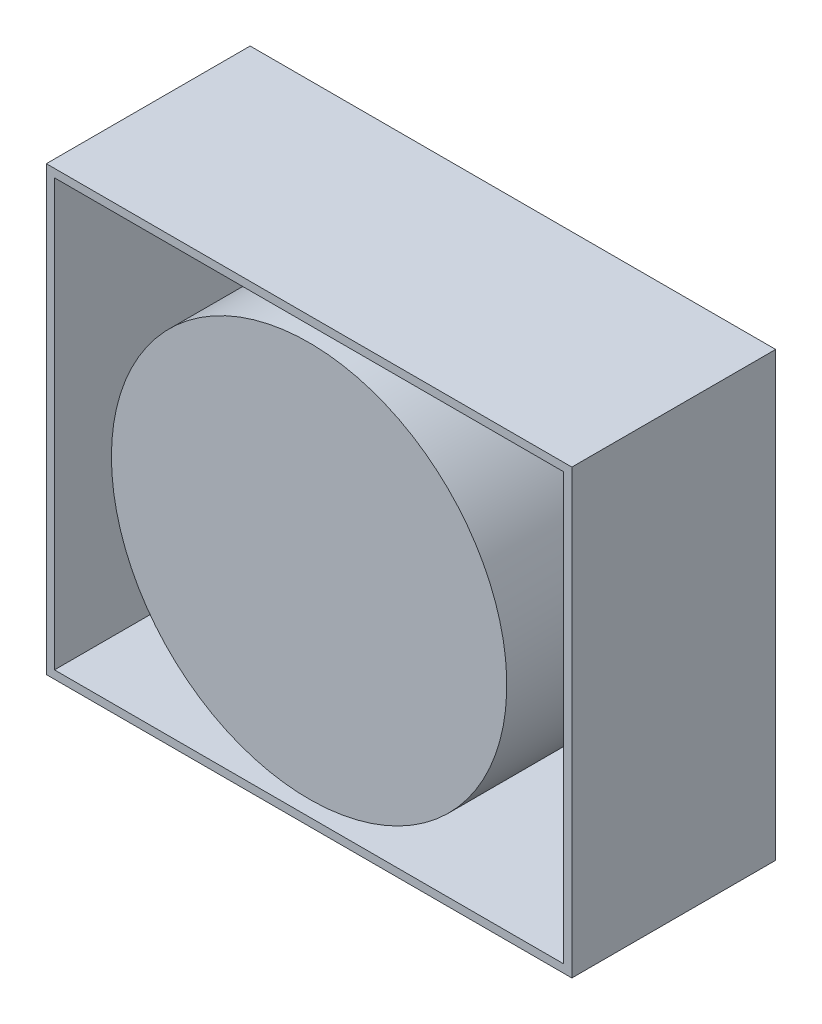
ISO-10303-21;
HEADER;
FILE_DESCRIPTION(('STEP AP214'),'2;1');
FILE_NAME('part.step','',(''),(''),'','','');
FILE_SCHEMA(('AUTOMOTIVE_DESIGN { 1 0 10303 214 1 1 1 1 }'));
ENDSEC;
DATA;
#1=APPLICATION_CONTEXT('core data for automotive mechanical design processes');
#2=APPLICATION_PROTOCOL_DEFINITION('international standard','automotive_design',2000,#1);
#3=PRODUCT_CONTEXT('',#1,'mechanical');
#4=PRODUCT('Part','Part','',(#3));
#5=PRODUCT_RELATED_PRODUCT_CATEGORY('part','',(#4));
#6=PRODUCT_DEFINITION_FORMATION('','',#4);
#7=PRODUCT_DEFINITION_CONTEXT('part definition',#1,'design');
#8=PRODUCT_DEFINITION('design','',#6,#7);
#9=PRODUCT_DEFINITION_SHAPE('','',#8);
#10=(LENGTH_UNIT() NAMED_UNIT(*) SI_UNIT(.MILLI.,.METRE.));
#11=(NAMED_UNIT(*) PLANE_ANGLE_UNIT() SI_UNIT($,.RADIAN.));
#12=(NAMED_UNIT(*) SI_UNIT($,.STERADIAN.) SOLID_ANGLE_UNIT());
#13=UNCERTAINTY_MEASURE_WITH_UNIT(LENGTH_MEASURE(1.E-05),#10,'distance_accuracy_value','');
#14=(GEOMETRIC_REPRESENTATION_CONTEXT(3) GLOBAL_UNCERTAINTY_ASSIGNED_CONTEXT((#13)) GLOBAL_UNIT_ASSIGNED_CONTEXT((#10,
#11,#12)) REPRESENTATION_CONTEXT('',''));
#15=CARTESIAN_POINT('',(0.,0.,0.));
#16=DIRECTION('',(0.,0.,1.));
#17=DIRECTION('',(1.,0.,0.));
#18=AXIS2_PLACEMENT_3D('',#15,#16,#17);
#19=CARTESIAN_POINT('',(46.4615487348284,43.7559565394266,20.));
#20=DIRECTION('',(0.,0.,-1.));
#21=DIRECTION('',(-1.,0.,0.));
#22=AXIS2_PLACEMENT_3D('',#19,#20,#21);
#23=CYLINDRICAL_SURFACE('',#22,6.12069122546169);
#24=CARTESIAN_POINT('',(46.4615487348284,43.7559565394266,20.));
#25=DIRECTION('',(0.,0.,1.));
#26=DIRECTION('',(1.,0.,0.));
#27=AXIS2_PLACEMENT_3D('',#24,#25,#26);
#28=CIRCLE('',#27,6.12069122546169);
#29=CARTESIAN_POINT('',(52.5822399602901,43.7559565394266,20.));
#30=VERTEX_POINT('',#29);
#31=EDGE_CURVE('E11',#30,#30,#28,.T.);
#32=ORIENTED_EDGE('',*,*,#31,.F.);
#33=EDGE_LOOP('',(#32));
#34=FACE_BOUND('',#33,.T.);
#35=CARTESIAN_POINT('',(46.4615487348284,43.7559565394266,0.));
#36=DIRECTION('',(0.,0.,1.));
#37=DIRECTION('',(1.,0.,0.));
#38=AXIS2_PLACEMENT_3D('',#35,#36,#37);
#39=CIRCLE('',#38,6.12069122546169);
#40=CARTESIAN_POINT('',(52.5822399602901,43.7559565394266,0.));
#41=VERTEX_POINT('',#40);
#42=EDGE_CURVE('E43',#41,#41,#39,.T.);
#43=ORIENTED_EDGE('',*,*,#42,.T.);
#44=EDGE_LOOP('',(#43));
#45=FACE_BOUND('',#44,.T.);
#46=ADVANCED_FACE('F40',(#34,#45),#23,.T.);
#47=CARTESIAN_POINT('',(46.4615487348284,43.7559565394266,20.));
#48=DIRECTION('',(0.,0.,1.));
#49=DIRECTION('',(1.,0.,0.));
#50=AXIS2_PLACEMENT_3D('',#47,#48,#49);
#51=PLANE('',#50);
#52=ORIENTED_EDGE('',*,*,#31,.T.);
#53=EDGE_LOOP('',(#52));
#54=FACE_BOUND('',#53,.T.);
#55=ADVANCED_FACE('F55',(#54),#51,.T.);
#56=CARTESIAN_POINT('',(46.4615487348284,43.7559565394266,0.));
#57=DIRECTION('',(0.,0.,1.));
#58=DIRECTION('',(1.,0.,0.));
#59=AXIS2_PLACEMENT_3D('',#56,#57,#58);
#60=PLANE('',#59);
#61=ORIENTED_EDGE('',*,*,#42,.F.);
#62=EDGE_LOOP('',(#61));
#63=FACE_BOUND('',#62,.T.);
#64=ADVANCED_FACE('F53',(#63),#60,.F.);
#65=CLOSED_SHELL('',(#46,#55,#64));
#66=MANIFOLD_SOLID_BREP('B2',#65);
#67=CARTESIAN_POINT('',(-51.1263628648313,41.5168457570252,20.));
#68=DIRECTION('',(0.,0.,-1.));
#69=DIRECTION('',(-1.,0.,0.));
#70=AXIS2_PLACEMENT_3D('',#67,#68,#69);
#71=CYLINDRICAL_SURFACE('',#70,6.99411062752672);
#72=CARTESIAN_POINT('',(-51.1263628648313,41.5168457570252,20.));
#73=DIRECTION('',(0.,0.,1.));
#74=DIRECTION('',(1.,0.,0.));
#75=AXIS2_PLACEMENT_3D('',#72,#73,#74);
#76=CIRCLE('',#75,6.99411062752672);
#77=CARTESIAN_POINT('',(-44.1322522373046,41.5168457570252,20.));
#78=VERTEX_POINT('',#77);
#79=EDGE_CURVE('E39',#78,#78,#76,.T.);
#80=ORIENTED_EDGE('',*,*,#79,.F.);
#81=EDGE_LOOP('',(#80));
#82=FACE_BOUND('',#81,.T.);
#83=CARTESIAN_POINT('',(-51.1263628648313,41.5168457570252,0.));
#84=DIRECTION('',(0.,0.,1.));
#85=DIRECTION('',(1.,0.,0.));
#86=AXIS2_PLACEMENT_3D('',#83,#84,#85);
#87=CIRCLE('',#86,6.99411062752672);
#88=CARTESIAN_POINT('',(-44.1322522373046,41.5168457570252,0.));
#89=VERTEX_POINT('',#88);
#90=EDGE_CURVE('E92',#89,#89,#87,.T.);
#91=ORIENTED_EDGE('',*,*,#90,.T.);
#92=EDGE_LOOP('',(#91));
#93=FACE_BOUND('',#92,.T.);
#94=ADVANCED_FACE('F89',(#82,#93),#71,.T.);
#95=CARTESIAN_POINT('',(-51.1263628648313,41.5168457570252,20.));
#96=DIRECTION('',(0.,0.,1.));
#97=DIRECTION('',(1.,0.,0.));
#98=AXIS2_PLACEMENT_3D('',#95,#96,#97);
#99=PLANE('',#98);
#100=ORIENTED_EDGE('',*,*,#79,.T.);
#101=EDGE_LOOP('',(#100));
#102=FACE_BOUND('',#101,.T.);
#103=ADVANCED_FACE('F104',(#102),#99,.T.);
#104=CARTESIAN_POINT('',(-51.1263628648313,41.5168457570252,0.));
#105=DIRECTION('',(0.,0.,1.));
#106=DIRECTION('',(1.,0.,0.));
#107=AXIS2_PLACEMENT_3D('',#104,#105,#106);
#108=PLANE('',#107);
#109=ORIENTED_EDGE('',*,*,#90,.F.);
#110=EDGE_LOOP('',(#109));
#111=FACE_BOUND('',#110,.T.);
#112=ADVANCED_FACE('F102',(#111),#108,.F.);
#113=CLOSED_SHELL('',(#94,#103,#112));
#114=MANIFOLD_SOLID_BREP('B6',#113);
#115=CARTESIAN_POINT('',(0.,0.,0.));
#116=DIRECTION('',(0.,0.,1.));
#117=DIRECTION('',(1.,0.,0.));
#118=AXIS2_PLACEMENT_3D('',#115,#116,#117);
#119=PLANE('',#118);
#120=CARTESIAN_POINT('',(0.,0.,0.));
#121=DIRECTION('',(0.,0.,1.));
#122=DIRECTION('',(1.,0.,0.));
#123=AXIS2_PLACEMENT_3D('',#120,#121,#122);
#124=CIRCLE('',#123,48.496570744109);
#125=CARTESIAN_POINT('',(48.496570744109,0.,0.));
#126=VERTEX_POINT('',#125);
#127=EDGE_CURVE('E146',#126,#126,#124,.T.);
#128=ORIENTED_EDGE('',*,*,#127,.F.);
#129=EDGE_LOOP('',(#128));
#130=FACE_BOUND('',#129,.T.);
#131=ADVANCED_FACE('F139',(#130),#119,.F.);
#132=CARTESIAN_POINT('',(0.,0.,187.16901614981));
#133=DIRECTION('',(0.,0.,-1.));
#134=DIRECTION('',(-1.,0.,0.));
#135=AXIS2_PLACEMENT_3D('',#132,#133,#134);
#136=CYLINDRICAL_SURFACE('',#135,48.496570744109);
#137=CARTESIAN_POINT('',(0.,0.,50.));
#138=DIRECTION('',(0.,0.,-1.));
#139=DIRECTION('',(-1.,0.,0.));
#140=AXIS2_PLACEMENT_3D('',#137,#138,#139);
#141=CIRCLE('',#140,48.496570744109);
#142=CARTESIAN_POINT('',(-48.496570744109,0.,50.));
#143=VERTEX_POINT('',#142);
#144=EDGE_CURVE('E88',#143,#143,#141,.T.);
#145=ORIENTED_EDGE('',*,*,#144,.T.);
#146=EDGE_LOOP('',(#145));
#147=FACE_BOUND('',#146,.T.);
#148=ORIENTED_EDGE('',*,*,#127,.T.);
#149=EDGE_LOOP('',(#148));
#150=FACE_BOUND('',#149,.T.);
#151=ADVANCED_FACE('F141',(#147,#150),#136,.T.);
#152=CARTESIAN_POINT('',(0.,0.,50.));
#153=DIRECTION('',(0.,0.,-1.));
#154=DIRECTION('',(-1.,0.,0.));
#155=AXIS2_PLACEMENT_3D('',#152,#153,#154);
#156=PLANE('',#155);
#157=ORIENTED_EDGE('',*,*,#144,.F.);
#158=EDGE_LOOP('',(#157));
#159=FACE_BOUND('',#158,.T.);
#160=ADVANCED_FACE('F157',(#159),#156,.F.);
#161=CLOSED_SHELL('',(#131,#151,#160));
#162=MANIFOLD_SOLID_BREP('B34',#161);
#163=CARTESIAN_POINT('',(0.,0.,50.));
#164=DIRECTION('',(0.,0.,-1.));
#165=DIRECTION('',(-1.,0.,0.));
#166=AXIS2_PLACEMENT_3D('',#163,#164,#165);
#167=PLANE('',#166);
#168=DIRECTION('',(-1.,0.,0.));
#169=VECTOR('',#168,1.);
#170=CARTESIAN_POINT('',(-64.4613113559961,54.2737712685208,50.));
#171=LINE('',#170,#169);
#172=CARTESIAN_POINT('',(64.4613113559961,54.2737712685208,50.));
#173=VERTEX_POINT('',#172);
#174=CARTESIAN_POINT('',(-64.4613113559961,54.2737712685208,50.));
#175=VERTEX_POINT('',#174);
#176=EDGE_CURVE('E281',#173,#175,#171,.T.);
#177=ORIENTED_EDGE('',*,*,#176,.T.);
#178=DIRECTION('',(0.,-1.,0.));
#179=VECTOR('',#178,1.);
#180=CARTESIAN_POINT('',(-64.4613113559961,54.2737712685208,50.));
#181=LINE('',#180,#179);
#182=CARTESIAN_POINT('',(-64.4613113559961,-54.2737712685208,50.));
#183=VERTEX_POINT('',#182);
#184=EDGE_CURVE('E284',#175,#183,#181,.T.);
#185=ORIENTED_EDGE('',*,*,#184,.T.);
#186=DIRECTION('',(1.,0.,0.));
#187=VECTOR('',#186,1.);
#188=CARTESIAN_POINT('',(-64.4613113559961,-54.2737712685208,50.));
#189=LINE('',#188,#187);
#190=CARTESIAN_POINT('',(64.4613113559961,-54.2737712685208,50.));
#191=VERTEX_POINT('',#190);
#192=EDGE_CURVE('E287',#183,#191,#189,.T.);
#193=ORIENTED_EDGE('',*,*,#192,.T.);
#194=DIRECTION('',(0.,1.,0.));
#195=VECTOR('',#194,1.);
#196=CARTESIAN_POINT('',(64.4613113559961,54.2737712685208,50.));
#197=LINE('',#196,#195);
#198=EDGE_CURVE('E289',#191,#173,#197,.T.);
#199=ORIENTED_EDGE('',*,*,#198,.T.);
#200=EDGE_LOOP('',(#177,#185,#193,#199));
#201=FACE_BOUND('',#200,.T.);
#202=DIRECTION('',(0.,1.,0.));
#203=VECTOR('',#202,1.);
#204=CARTESIAN_POINT('',(62.4613113559961,52.2737712685208,50.));
#205=LINE('',#204,#203);
#206=CARTESIAN_POINT('',(62.4613113559961,-52.2737712685208,50.));
#207=VERTEX_POINT('',#206);
#208=CARTESIAN_POINT('',(62.4613113559961,52.2737712685208,50.));
#209=VERTEX_POINT('',#208);
#210=EDGE_CURVE('E245',#207,#209,#205,.T.);
#211=ORIENTED_EDGE('',*,*,#210,.F.);
#212=DIRECTION('',(1.,0.,0.));
#213=VECTOR('',#212,1.);
#214=CARTESIAN_POINT('',(-62.4613113559961,-52.2737712685208,50.));
#215=LINE('',#214,#213);
#216=CARTESIAN_POINT('',(-62.4613113559961,-52.2737712685208,50.));
#217=VERTEX_POINT('',#216);
#218=EDGE_CURVE('E267',#217,#207,#215,.T.);
#219=ORIENTED_EDGE('',*,*,#218,.F.);
#220=DIRECTION('',(0.,-1.,0.));
#221=VECTOR('',#220,1.);
#222=CARTESIAN_POINT('',(-62.4613113559961,52.2737712685208,50.));
#223=LINE('',#222,#221);
#224=CARTESIAN_POINT('',(-62.4613113559961,52.2737712685208,50.));
#225=VERTEX_POINT('',#224);
#226=EDGE_CURVE('E265',#225,#217,#223,.T.);
#227=ORIENTED_EDGE('',*,*,#226,.F.);
#228=DIRECTION('',(-1.,0.,0.));
#229=VECTOR('',#228,1.);
#230=CARTESIAN_POINT('',(-62.4613113559961,52.2737712685208,50.));
#231=LINE('',#230,#229);
#232=EDGE_CURVE('E253',#209,#225,#231,.T.);
#233=ORIENTED_EDGE('',*,*,#232,.F.);
#234=EDGE_LOOP('',(#211,#219,#227,#233));
#235=FACE_BOUND('',#234,.T.);
#236=ADVANCED_FACE('F180',(#201,#235),#167,.F.);
#237=CARTESIAN_POINT('',(0.,0.,0.));
#238=DIRECTION('',(0.,0.,-1.));
#239=DIRECTION('',(-1.,0.,0.));
#240=AXIS2_PLACEMENT_3D('',#237,#238,#239);
#241=PLANE('',#240);
#242=DIRECTION('',(-1.,0.,0.));
#243=VECTOR('',#242,1.);
#244=CARTESIAN_POINT('',(-64.4613113559961,54.2737712685208,0.));
#245=LINE('',#244,#243);
#246=CARTESIAN_POINT('',(64.4613113559961,54.2737712685208,0.));
#247=VERTEX_POINT('',#246);
#248=CARTESIAN_POINT('',(-64.4613113559961,54.2737712685208,0.));
#249=VERTEX_POINT('',#248);
#250=EDGE_CURVE('E261',#247,#249,#245,.T.);
#251=ORIENTED_EDGE('',*,*,#250,.F.);
#252=DIRECTION('',(0.,1.,0.));
#253=VECTOR('',#252,1.);
#254=CARTESIAN_POINT('',(64.4613113559961,54.2737712685208,0.));
#255=LINE('',#254,#253);
#256=CARTESIAN_POINT('',(64.4613113559961,-54.2737712685208,0.));
#257=VERTEX_POINT('',#256);
#258=EDGE_CURVE('E285',#257,#247,#255,.T.);
#259=ORIENTED_EDGE('',*,*,#258,.F.);
#260=DIRECTION('',(1.,0.,0.));
#261=VECTOR('',#260,1.);
#262=CARTESIAN_POINT('',(-64.4613113559961,-54.2737712685208,0.));
#263=LINE('',#262,#261);
#264=CARTESIAN_POINT('',(-64.4613113559961,-54.2737712685208,0.));
#265=VERTEX_POINT('',#264);
#266=EDGE_CURVE('E296',#265,#257,#263,.T.);
#267=ORIENTED_EDGE('',*,*,#266,.F.);
#268=DIRECTION('',(0.,-1.,0.));
#269=VECTOR('',#268,1.);
#270=CARTESIAN_POINT('',(-64.4613113559961,54.2737712685208,0.));
#271=LINE('',#270,#269);
#272=EDGE_CURVE('E294',#249,#265,#271,.T.);
#273=ORIENTED_EDGE('',*,*,#272,.F.);
#274=EDGE_LOOP('',(#251,#259,#267,#273));
#275=FACE_BOUND('',#274,.T.);
#276=DIRECTION('',(1.,0.,0.));
#277=VECTOR('',#276,1.);
#278=CARTESIAN_POINT('',(-62.4613113559961,-52.2737712685208,0.));
#279=LINE('',#278,#277);
#280=CARTESIAN_POINT('',(-62.4613113559961,-52.2737712685208,0.));
#281=VERTEX_POINT('',#280);
#282=CARTESIAN_POINT('',(62.4613113559961,-52.2737712685208,0.));
#283=VERTEX_POINT('',#282);
#284=EDGE_CURVE('E254',#281,#283,#279,.T.);
#285=ORIENTED_EDGE('',*,*,#284,.T.);
#286=DIRECTION('',(0.,1.,0.));
#287=VECTOR('',#286,1.);
#288=CARTESIAN_POINT('',(62.4613113559961,52.2737712685208,0.));
#289=LINE('',#288,#287);
#290=CARTESIAN_POINT('',(62.4613113559961,52.2737712685208,0.));
#291=VERTEX_POINT('',#290);
#292=EDGE_CURVE('E203',#283,#291,#289,.T.);
#293=ORIENTED_EDGE('',*,*,#292,.T.);
#294=DIRECTION('',(-1.,0.,0.));
#295=VECTOR('',#294,1.);
#296=CARTESIAN_POINT('',(-62.4613113559961,52.2737712685208,0.));
#297=LINE('',#296,#295);
#298=CARTESIAN_POINT('',(-62.4613113559961,52.2737712685208,0.));
#299=VERTEX_POINT('',#298);
#300=EDGE_CURVE('E260',#291,#299,#297,.T.);
#301=ORIENTED_EDGE('',*,*,#300,.T.);
#302=DIRECTION('',(0.,-1.,0.));
#303=VECTOR('',#302,1.);
#304=CARTESIAN_POINT('',(-62.4613113559961,52.2737712685208,0.));
#305=LINE('',#304,#303);
#306=EDGE_CURVE('E273',#299,#281,#305,.T.);
#307=ORIENTED_EDGE('',*,*,#306,.T.);
#308=EDGE_LOOP('',(#285,#293,#301,#307));
#309=FACE_BOUND('',#308,.T.);
#310=ADVANCED_FACE('F314',(#275,#309),#241,.T.);
#311=CARTESIAN_POINT('',(-64.4613113559961,54.2737712685208,50.));
#312=DIRECTION('',(0.,-1.,0.));
#313=DIRECTION('',(0.,0.,-1.));
#314=AXIS2_PLACEMENT_3D('',#311,#312,#313);
#315=PLANE('',#314);
#316=ORIENTED_EDGE('',*,*,#250,.T.);
#317=DIRECTION('',(0.,0.,-1.));
#318=VECTOR('',#317,1.);
#319=CARTESIAN_POINT('',(-64.4613113559961,54.2737712685208,50.));
#320=LINE('',#319,#318);
#321=EDGE_CURVE('E137',#175,#249,#320,.T.);
#322=ORIENTED_EDGE('',*,*,#321,.F.);
#323=ORIENTED_EDGE('',*,*,#176,.F.);
#324=DIRECTION('',(0.,0.,-1.));
#325=VECTOR('',#324,1.);
#326=CARTESIAN_POINT('',(64.4613113559961,54.2737712685208,50.));
#327=LINE('',#326,#325);
#328=EDGE_CURVE('E291',#173,#247,#327,.T.);
#329=ORIENTED_EDGE('',*,*,#328,.T.);
#330=EDGE_LOOP('',(#316,#322,#323,#329));
#331=FACE_BOUND('',#330,.T.);
#332=ADVANCED_FACE('F182',(#331),#315,.F.);
#333=CARTESIAN_POINT('',(-64.4613113559961,54.2737712685208,50.));
#334=DIRECTION('',(1.,0.,0.));
#335=DIRECTION('',(0.,0.,-1.));
#336=AXIS2_PLACEMENT_3D('',#333,#334,#335);
#337=PLANE('',#336);
#338=ORIENTED_EDGE('',*,*,#272,.T.);
#339=DIRECTION('',(0.,0.,-1.));
#340=VECTOR('',#339,1.);
#341=CARTESIAN_POINT('',(-64.4613113559961,-54.2737712685208,50.));
#342=LINE('',#341,#340);
#343=EDGE_CURVE('E188',#183,#265,#342,.T.);
#344=ORIENTED_EDGE('',*,*,#343,.F.);
#345=ORIENTED_EDGE('',*,*,#184,.F.);
#346=ORIENTED_EDGE('',*,*,#321,.T.);
#347=EDGE_LOOP('',(#338,#344,#345,#346));
#348=FACE_BOUND('',#347,.T.);
#349=ADVANCED_FACE('F324',(#348),#337,.F.);
#350=CARTESIAN_POINT('',(-64.4613113559961,-54.2737712685208,50.));
#351=DIRECTION('',(0.,1.,0.));
#352=DIRECTION('',(0.,0.,1.));
#353=AXIS2_PLACEMENT_3D('',#350,#351,#352);
#354=PLANE('',#353);
#355=ORIENTED_EDGE('',*,*,#266,.T.);
#356=DIRECTION('',(0.,0.,-1.));
#357=VECTOR('',#356,1.);
#358=CARTESIAN_POINT('',(64.4613113559961,-54.2737712685208,50.));
#359=LINE('',#358,#357);
#360=EDGE_CURVE('E301',#191,#257,#359,.T.);
#361=ORIENTED_EDGE('',*,*,#360,.F.);
#362=ORIENTED_EDGE('',*,*,#192,.F.);
#363=ORIENTED_EDGE('',*,*,#343,.T.);
#364=EDGE_LOOP('',(#355,#361,#362,#363));
#365=FACE_BOUND('',#364,.T.);
#366=ADVANCED_FACE('F308',(#365),#354,.F.);
#367=CARTESIAN_POINT('',(64.4613113559961,54.2737712685208,50.));
#368=DIRECTION('',(-1.,0.,0.));
#369=DIRECTION('',(0.,0.,1.));
#370=AXIS2_PLACEMENT_3D('',#367,#368,#369);
#371=PLANE('',#370);
#372=ORIENTED_EDGE('',*,*,#258,.T.);
#373=ORIENTED_EDGE('',*,*,#328,.F.);
#374=ORIENTED_EDGE('',*,*,#198,.F.);
#375=ORIENTED_EDGE('',*,*,#360,.T.);
#376=EDGE_LOOP('',(#372,#373,#374,#375));
#377=FACE_BOUND('',#376,.T.);
#378=ADVANCED_FACE('F318',(#377),#371,.F.);
#379=CARTESIAN_POINT('',(62.4613113559961,52.2737712685208,50.));
#380=DIRECTION('',(-1.,0.,0.));
#381=DIRECTION('',(0.,0.,1.));
#382=AXIS2_PLACEMENT_3D('',#379,#380,#381);
#383=PLANE('',#382);
#384=ORIENTED_EDGE('',*,*,#292,.F.);
#385=DIRECTION('',(0.,0.,-1.));
#386=VECTOR('',#385,1.);
#387=CARTESIAN_POINT('',(62.4613113559961,-52.2737712685208,50.));
#388=LINE('',#387,#386);
#389=EDGE_CURVE('E249',#207,#283,#388,.T.);
#390=ORIENTED_EDGE('',*,*,#389,.F.);
#391=ORIENTED_EDGE('',*,*,#210,.T.);
#392=DIRECTION('',(0.,0.,-1.));
#393=VECTOR('',#392,1.);
#394=CARTESIAN_POINT('',(62.4613113559961,52.2737712685208,50.));
#395=LINE('',#394,#393);
#396=EDGE_CURVE('E248',#209,#291,#395,.T.);
#397=ORIENTED_EDGE('',*,*,#396,.T.);
#398=EDGE_LOOP('',(#384,#390,#391,#397));
#399=FACE_BOUND('',#398,.T.);
#400=ADVANCED_FACE('F247',(#399),#383,.T.);
#401=CARTESIAN_POINT('',(-62.4613113559961,52.2737712685208,50.));
#402=DIRECTION('',(0.,-1.,0.));
#403=DIRECTION('',(0.,0.,-1.));
#404=AXIS2_PLACEMENT_3D('',#401,#402,#403);
#405=PLANE('',#404);
#406=ORIENTED_EDGE('',*,*,#300,.F.);
#407=ORIENTED_EDGE('',*,*,#396,.F.);
#408=ORIENTED_EDGE('',*,*,#232,.T.);
#409=DIRECTION('',(0.,0.,-1.));
#410=VECTOR('',#409,1.);
#411=CARTESIAN_POINT('',(-62.4613113559961,52.2737712685208,50.));
#412=LINE('',#411,#410);
#413=EDGE_CURVE('E262',#225,#299,#412,.T.);
#414=ORIENTED_EDGE('',*,*,#413,.T.);
#415=EDGE_LOOP('',(#406,#407,#408,#414));
#416=FACE_BOUND('',#415,.T.);
#417=ADVANCED_FACE('F257',(#416),#405,.T.);
#418=CARTESIAN_POINT('',(-62.4613113559961,52.2737712685208,50.));
#419=DIRECTION('',(1.,0.,0.));
#420=DIRECTION('',(0.,0.,-1.));
#421=AXIS2_PLACEMENT_3D('',#418,#419,#420);
#422=PLANE('',#421);
#423=ORIENTED_EDGE('',*,*,#306,.F.);
#424=ORIENTED_EDGE('',*,*,#413,.F.);
#425=ORIENTED_EDGE('',*,*,#226,.T.);
#426=DIRECTION('',(0.,0.,-1.));
#427=VECTOR('',#426,1.);
#428=CARTESIAN_POINT('',(-62.4613113559961,-52.2737712685208,50.));
#429=LINE('',#428,#427);
#430=EDGE_CURVE('E195',#217,#281,#429,.T.);
#431=ORIENTED_EDGE('',*,*,#430,.T.);
#432=EDGE_LOOP('',(#423,#424,#425,#431));
#433=FACE_BOUND('',#432,.T.);
#434=ADVANCED_FACE('F347',(#433),#422,.T.);
#435=CARTESIAN_POINT('',(-62.4613113559961,-52.2737712685208,50.));
#436=DIRECTION('',(0.,1.,0.));
#437=DIRECTION('',(0.,0.,1.));
#438=AXIS2_PLACEMENT_3D('',#435,#436,#437);
#439=PLANE('',#438);
#440=ORIENTED_EDGE('',*,*,#284,.F.);
#441=ORIENTED_EDGE('',*,*,#430,.F.);
#442=ORIENTED_EDGE('',*,*,#218,.T.);
#443=ORIENTED_EDGE('',*,*,#389,.T.);
#444=EDGE_LOOP('',(#440,#441,#442,#443));
#445=FACE_BOUND('',#444,.T.);
#446=ADVANCED_FACE('F351',(#445),#439,.T.);
#447=CLOSED_SHELL('',(#236,#310,#332,#349,#366,#378,#400,#417,#434,#446));
#448=MANIFOLD_SOLID_BREP('B83',#447);
#449=ADVANCED_BREP_SHAPE_REPRESENTATION('',(#18,#66,#114,#162,#448),#14);
#450=SHAPE_DEFINITION_REPRESENTATION(#9,#449);
ENDSEC;
END-ISO-10303-21;
